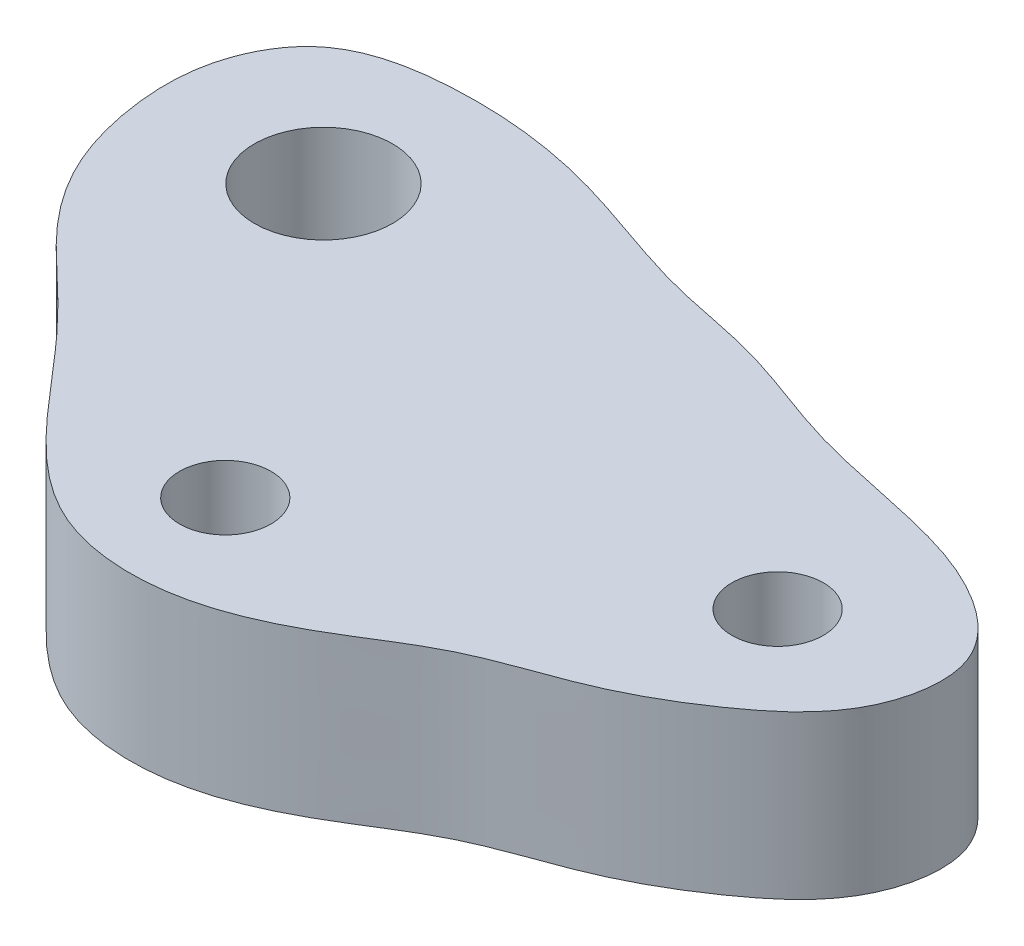
ISO-10303-21;
HEADER;
FILE_DESCRIPTION(('STEP AP214'),'2;1');
FILE_NAME('part.step','',(''),(''),'','','');
FILE_SCHEMA(('AUTOMOTIVE_DESIGN { 1 0 10303 214 1 1 1 1 }'));
ENDSEC;
DATA;
#1=APPLICATION_CONTEXT('core data for automotive mechanical design processes');
#2=APPLICATION_PROTOCOL_DEFINITION('international standard','automotive_design',2000,#1);
#3=PRODUCT_CONTEXT('',#1,'mechanical');
#4=PRODUCT('Part','Part','',(#3));
#5=PRODUCT_RELATED_PRODUCT_CATEGORY('part','',(#4));
#6=PRODUCT_DEFINITION_FORMATION('','',#4);
#7=PRODUCT_DEFINITION_CONTEXT('part definition',#1,'design');
#8=PRODUCT_DEFINITION('design','',#6,#7);
#9=PRODUCT_DEFINITION_SHAPE('','',#8);
#10=(LENGTH_UNIT() NAMED_UNIT(*) SI_UNIT(.MILLI.,.METRE.));
#11=(NAMED_UNIT(*) PLANE_ANGLE_UNIT() SI_UNIT($,.RADIAN.));
#12=(NAMED_UNIT(*) SI_UNIT($,.STERADIAN.) SOLID_ANGLE_UNIT());
#13=UNCERTAINTY_MEASURE_WITH_UNIT(LENGTH_MEASURE(1.E-05),#10,'distance_accuracy_value','');
#14=(GEOMETRIC_REPRESENTATION_CONTEXT(3) GLOBAL_UNCERTAINTY_ASSIGNED_CONTEXT((#13)) GLOBAL_UNIT_ASSIGNED_CONTEXT((#10,
#11,#12)) REPRESENTATION_CONTEXT('',''));
#15=CARTESIAN_POINT('',(0.,0.,0.));
#16=DIRECTION('',(0.,0.,1.));
#17=DIRECTION('',(1.,0.,0.));
#18=AXIS2_PLACEMENT_3D('',#15,#16,#17);
#19=CARTESIAN_POINT('',(-64.3793822516759,4.00000000000001,-45.0456322849649));
#20=DIRECTION('',(0.,-1.,0.));
#21=DIRECTION('',(0.,0.,-1.));
#22=AXIS2_PLACEMENT_3D('',#19,#20,#21);
#23=PLANE('',#22);
#24=CARTESIAN_POINT('',(-74.3073784297366,4.00000000000001,-35.9510132719408));
#25=CARTESIAN_POINT('',(-73.5870389389161,4.00000000000001,-35.1521562315738));
#26=CARTESIAN_POINT('',(-72.0658776419073,4.00000000000001,-33.6821507190232));
#27=CARTESIAN_POINT('',(-68.8977365658682,4.00000000000001,-33.4713597546452));
#28=CARTESIAN_POINT('',(-66.3986989792774,4.,-34.5968799379288));
#29=CARTESIAN_POINT('',(-64.2645187797016,4.,-36.0948426547778));
#30=CARTESIAN_POINT('',(-61.8441970208924,4.,-36.7907809353124));
#31=CARTESIAN_POINT('',(-59.6977893728077,4.,-38.0333714589108));
#32=CARTESIAN_POINT('',(-57.8457933374121,4.00000000000001,-39.6028957421072));
#33=CARTESIAN_POINT('',(-57.3741190708636,4.00000000000001,-42.260861107386));
#34=CARTESIAN_POINT('',(-59.3059779275018,4.00000000000001,-43.7346258687508));
#35=CARTESIAN_POINT('',(-61.6489052931392,4.00000000000001,-44.4819399853688));
#36=CARTESIAN_POINT('',(-64.3051360840181,4.00000000000001,-44.8796083394168));
#37=CARTESIAN_POINT('',(-66.8643430749609,4.00000000000001,-46.0170657529963));
#38=CARTESIAN_POINT('',(-69.7082847535664,4.00000000000001,-46.4306644996891));
#39=CARTESIAN_POINT('',(-72.6520983602564,4.00000000000001,-47.6937727014437));
#40=CARTESIAN_POINT('',(-75.9084788817291,4.00000000000007,-48.1122774272689));
#41=CARTESIAN_POINT('',(-78.8817572793034,4.00000000000007,-47.5950203872229));
#42=CARTESIAN_POINT('',(-79.9743710877889,4.00000000000007,-45.4962511014091));
#43=CARTESIAN_POINT('',(-79.9240780190859,4.00000000000007,-43.5469021387944));
#44=CARTESIAN_POINT('',(-79.384569757071,4.00000000000007,-41.6320740104607));
#45=CARTESIAN_POINT('',(-78.27012880661,4.00000000000007,-40.0554496774952));
#46=CARTESIAN_POINT('',(-76.9655488214054,4.00000000000007,-38.8872395123596));
#47=CARTESIAN_POINT('',(-75.6423768233567,4.00000000000001,-37.5340514212804));
#48=CARTESIAN_POINT('',(-74.8428555985566,4.00000000000001,-36.5448578573326));
#49=CARTESIAN_POINT('',(-74.3073784297366,4.00000000000001,-35.9510132719408));
#50=B_SPLINE_CURVE_WITH_KNOTS('',3,(#24,#25,#26,#27,#28,#29,#30,#31,#32,#33,#34,#35,#36,#37,#38,
#39,#40,#41,#42,#43,#44,#45,#46,#47,#48,#49),.UNSPECIFIED.,.T.,.F.,(4,1,1,1,1,1,1,1,1,1,1,1,1,1,
1,1,1,1,1,1,1,1,1,4),(0.,0.0560834453172394,0.10666944692333,0.156385640873406,
0.198717511797198,0.243598808397355,0.287767022566972,0.329348212005236,0.369066001203825,
0.41002939992208,0.442664170142284,0.500846370765793,0.55016433876303,0.589406534053882,
0.651753106532799,0.717086810143514,0.764390719886418,0.796650952189162,0.831997761169295,
0.865804621586696,0.900321096724624,0.932192957339777,0.95830937370664,1.),.UNSPECIFIED.);
#51=CARTESIAN_POINT('',(-74.3073784297366,4.00000000000001,-35.9510132719408));
#52=VERTEX_POINT('',#51);
#53=EDGE_CURVE('E10',#52,#52,#50,.T.);
#54=ORIENTED_EDGE('',*,*,#53,.T.);
#55=EDGE_LOOP('',(#54));
#56=FACE_BOUND('',#55,.T.);
#57=CARTESIAN_POINT('',(-75.8640338591477,4.00000000000007,-44.3038379673483));
#58=DIRECTION('',(0.,1.,0.));
#59=DIRECTION('',(0.,0.,1.));
#60=AXIS2_PLACEMENT_3D('',#57,#58,#59);
#61=CIRCLE('',#60,1.7);
#62=CARTESIAN_POINT('',(-75.8640338591477,4.00000000000007,-42.6038379673483));
#63=VERTEX_POINT('',#62);
#64=EDGE_CURVE('E41',#63,#63,#61,.T.);
#65=ORIENTED_EDGE('',*,*,#64,.F.);
#66=EDGE_LOOP('',(#65));
#67=FACE_BOUND('',#66,.T.);
#68=CARTESIAN_POINT('',(-61.208485269674,4.00000000000001,-40.8247210790052));
#69=DIRECTION('',(0.,1.,0.));
#70=DIRECTION('',(0.,0.,1.));
#71=AXIS2_PLACEMENT_3D('',#68,#69,#70);
#72=CIRCLE('',#71,1.125);
#73=CARTESIAN_POINT('',(-61.208485269674,4.00000000000001,-39.6997210790052));
#74=VERTEX_POINT('',#73);
#75=EDGE_CURVE('E52',#74,#74,#72,.T.);
#76=ORIENTED_EDGE('',*,*,#75,.F.);
#77=EDGE_LOOP('',(#76));
#78=FACE_BOUND('',#77,.T.);
#79=CARTESIAN_POINT('',(-70.3795266865229,4.00000000000001,-36.4027048732255));
#80=DIRECTION('',(0.,1.,0.));
#81=DIRECTION('',(0.,0.,1.));
#82=AXIS2_PLACEMENT_3D('',#79,#80,#81);
#83=CIRCLE('',#82,1.125);
#84=CARTESIAN_POINT('',(-70.3795266865229,4.00000000000001,-35.2777048732255));
#85=VERTEX_POINT('',#84);
#86=EDGE_CURVE('E58',#85,#85,#83,.T.);
#87=ORIENTED_EDGE('',*,*,#86,.F.);
#88=EDGE_LOOP('',(#87));
#89=FACE_BOUND('',#88,.T.);
#90=ADVANCED_FACE('F28',(#56,#67,#78,#89),#23,.F.);
#91=CARTESIAN_POINT('',(-64.3793822516759,0.,-45.0456322849649));
#92=DIRECTION('',(0.,-1.,0.));
#93=DIRECTION('',(0.,0.,-1.));
#94=AXIS2_PLACEMENT_3D('',#91,#92,#93);
#95=PLANE('',#94);
#96=CARTESIAN_POINT('',(-61.208485269674,0.,-40.8247210790052));
#97=DIRECTION('',(0.,1.,0.));
#98=DIRECTION('',(0.,0.,1.));
#99=AXIS2_PLACEMENT_3D('',#96,#97,#98);
#100=CIRCLE('',#99,1.125);
#101=CARTESIAN_POINT('',(-61.208485269674,0.,-39.6997210790052));
#102=VERTEX_POINT('',#101);
#103=EDGE_CURVE('E55',#102,#102,#100,.T.);
#104=ORIENTED_EDGE('',*,*,#103,.T.);
#105=EDGE_LOOP('',(#104));
#106=FACE_BOUND('',#105,.T.);
#107=CARTESIAN_POINT('',(-74.3073784297365,0.,-35.9510132719408));
#108=CARTESIAN_POINT('',(-73.5870389389159,0.,-35.1521562315738));
#109=CARTESIAN_POINT('',(-72.0658776419073,0.,-33.6821507190232));
#110=CARTESIAN_POINT('',(-68.8977365658682,0.,-33.4713597546452));
#111=CARTESIAN_POINT('',(-66.3986989792774,0.,-34.5968799379288));
#112=CARTESIAN_POINT('',(-64.2645187797016,0.,-36.0948426547778));
#113=CARTESIAN_POINT('',(-61.8441970208924,0.,-36.7907809353124));
#114=CARTESIAN_POINT('',(-59.6977893728076,0.,-38.0333714589107));
#115=CARTESIAN_POINT('',(-57.8457933374121,0.,-39.6028957421072));
#116=CARTESIAN_POINT('',(-57.3741190708636,0.,-42.260861107386));
#117=CARTESIAN_POINT('',(-59.3059779275018,0.,-43.7346258687508));
#118=CARTESIAN_POINT('',(-61.6489052931392,0.,-44.4819399853688));
#119=CARTESIAN_POINT('',(-64.3051360840181,0.,-44.8796083394168));
#120=CARTESIAN_POINT('',(-66.8643430749609,0.,-46.0170657529963));
#121=CARTESIAN_POINT('',(-69.7082847535664,0.,-46.4306644996891));
#122=CARTESIAN_POINT('',(-72.6520983602564,0.,-47.6937727014437));
#123=CARTESIAN_POINT('',(-75.9084788817291,0.,-48.1122774272689));
#124=CARTESIAN_POINT('',(-78.8817572793034,0.,-47.5950203872229));
#125=CARTESIAN_POINT('',(-79.9743710877889,0.,-45.4962511014091));
#126=CARTESIAN_POINT('',(-79.9240780190859,0.,-43.5469021387944));
#127=CARTESIAN_POINT('',(-79.384569757071,0.,-41.6320740104607));
#128=CARTESIAN_POINT('',(-78.2701288066101,0.,-40.0554496774952));
#129=CARTESIAN_POINT('',(-76.9655488214054,0.,-38.8872395123596));
#130=CARTESIAN_POINT('',(-75.6423768233567,0.,-37.5340514212804));
#131=CARTESIAN_POINT('',(-74.8428555985565,0.,-36.5448578573326));
#132=CARTESIAN_POINT('',(-74.3073784297365,0.,-35.9510132719408));
#133=B_SPLINE_CURVE_WITH_KNOTS('',3,(#107,#108,#109,#110,#111,#112,#113,#114,#115,#116,#117,
#118,#119,#120,#121,#122,#123,#124,#125,#126,#127,#128,#129,#130,#131,#132),.UNSPECIFIED.,.T.,
.F.,(4,1,1,1,1,1,1,1,1,1,1,1,1,1,1,1,1,1,1,1,1,1,1,4),(0.,0.0560834453172394,0.10666944692333,
0.156385640873406,0.198717511797198,0.243598808397355,0.287767022566972,0.329348212005236,
0.369066001203825,0.41002939992208,0.442664170142284,0.500846370765793,0.55016433876303,
0.589406534053882,0.651753106532799,0.717086810143514,0.764390719886418,0.796650952189162,
0.831997761169295,0.865804621586696,0.900321096724624,0.932192957339777,0.95830937370664,1.),.UNSPECIFIED.);
#134=CARTESIAN_POINT('',(-74.3073784297365,0.,-35.9510132719408));
#135=VERTEX_POINT('',#134);
#136=EDGE_CURVE('E33',#135,#135,#133,.T.);
#137=ORIENTED_EDGE('',*,*,#136,.F.);
#138=EDGE_LOOP('',(#137));
#139=FACE_BOUND('',#138,.T.);
#140=CARTESIAN_POINT('',(-75.8640338591477,0.,-44.3038379673483));
#141=DIRECTION('',(0.,1.,0.));
#142=DIRECTION('',(0.,0.,1.));
#143=AXIS2_PLACEMENT_3D('',#140,#141,#142);
#144=CIRCLE('',#143,1.7);
#145=CARTESIAN_POINT('',(-75.8640338591477,0.,-42.6038379673483));
#146=VERTEX_POINT('',#145);
#147=EDGE_CURVE('E46',#146,#146,#144,.T.);
#148=ORIENTED_EDGE('',*,*,#147,.T.);
#149=EDGE_LOOP('',(#148));
#150=FACE_BOUND('',#149,.T.);
#151=CARTESIAN_POINT('',(-70.3795266865229,0.,-36.4027048732255));
#152=DIRECTION('',(0.,1.,0.));
#153=DIRECTION('',(0.,0.,1.));
#154=AXIS2_PLACEMENT_3D('',#151,#152,#153);
#155=CIRCLE('',#154,1.125);
#156=CARTESIAN_POINT('',(-70.3795266865229,0.,-35.2777048732255));
#157=VERTEX_POINT('',#156);
#158=EDGE_CURVE('E61',#157,#157,#155,.T.);
#159=ORIENTED_EDGE('',*,*,#158,.T.);
#160=EDGE_LOOP('',(#159));
#161=FACE_BOUND('',#160,.T.);
#162=ADVANCED_FACE('F71',(#106,#139,#150,#161),#95,.T.);
#163=DIRECTION('',(0.,-1.,0.));
#164=VECTOR('',#163,1.);
#165=SURFACE_OF_LINEAR_EXTRUSION('',#50,#164);
#166=ORIENTED_EDGE('',*,*,#53,.F.);
#167=EDGE_LOOP('',(#166));
#168=FACE_BOUND('',#167,.T.);
#169=ORIENTED_EDGE('',*,*,#136,.T.);
#170=EDGE_LOOP('',(#169));
#171=FACE_BOUND('',#170,.T.);
#172=ADVANCED_FACE('F30',(#168,#171),#165,.F.);
#173=CARTESIAN_POINT('',(-75.8640338591477,4.00000000000007,-44.3038379673483));
#174=DIRECTION('',(0.,-1.,0.));
#175=DIRECTION('',(0.,0.,-1.));
#176=AXIS2_PLACEMENT_3D('',#173,#174,#175);
#177=CYLINDRICAL_SURFACE('',#176,1.7);
#178=ORIENTED_EDGE('',*,*,#64,.T.);
#179=EDGE_LOOP('',(#178));
#180=FACE_BOUND('',#179,.T.);
#181=ORIENTED_EDGE('',*,*,#147,.F.);
#182=EDGE_LOOP('',(#181));
#183=FACE_BOUND('',#182,.T.);
#184=ADVANCED_FACE('F79',(#180,#183),#177,.F.);
#185=CARTESIAN_POINT('',(-61.208485269674,4.00000000000001,-40.8247210790052));
#186=DIRECTION('',(0.,-1.,0.));
#187=DIRECTION('',(0.,0.,-1.));
#188=AXIS2_PLACEMENT_3D('',#185,#186,#187);
#189=CYLINDRICAL_SURFACE('',#188,1.125);
#190=ORIENTED_EDGE('',*,*,#75,.T.);
#191=EDGE_LOOP('',(#190));
#192=FACE_BOUND('',#191,.T.);
#193=ORIENTED_EDGE('',*,*,#103,.F.);
#194=EDGE_LOOP('',(#193));
#195=FACE_BOUND('',#194,.T.);
#196=ADVANCED_FACE('F82',(#192,#195),#189,.F.);
#197=CARTESIAN_POINT('',(-70.3795266865229,4.00000000000001,-36.4027048732255));
#198=DIRECTION('',(0.,-1.,0.));
#199=DIRECTION('',(0.,0.,-1.));
#200=AXIS2_PLACEMENT_3D('',#197,#198,#199);
#201=CYLINDRICAL_SURFACE('',#200,1.125);
#202=ORIENTED_EDGE('',*,*,#86,.T.);
#203=EDGE_LOOP('',(#202));
#204=FACE_BOUND('',#203,.T.);
#205=ORIENTED_EDGE('',*,*,#158,.F.);
#206=EDGE_LOOP('',(#205));
#207=FACE_BOUND('',#206,.T.);
#208=ADVANCED_FACE('F67',(#204,#207),#201,.F.);
#209=CLOSED_SHELL('',(#90,#162,#172,#184,#196,#208));
#210=MANIFOLD_SOLID_BREP('B2',#209);
#211=ADVANCED_BREP_SHAPE_REPRESENTATION('',(#18,#210),#14);
#212=SHAPE_DEFINITION_REPRESENTATION(#9,#211);
ENDSEC;
END-ISO-10303-21;
